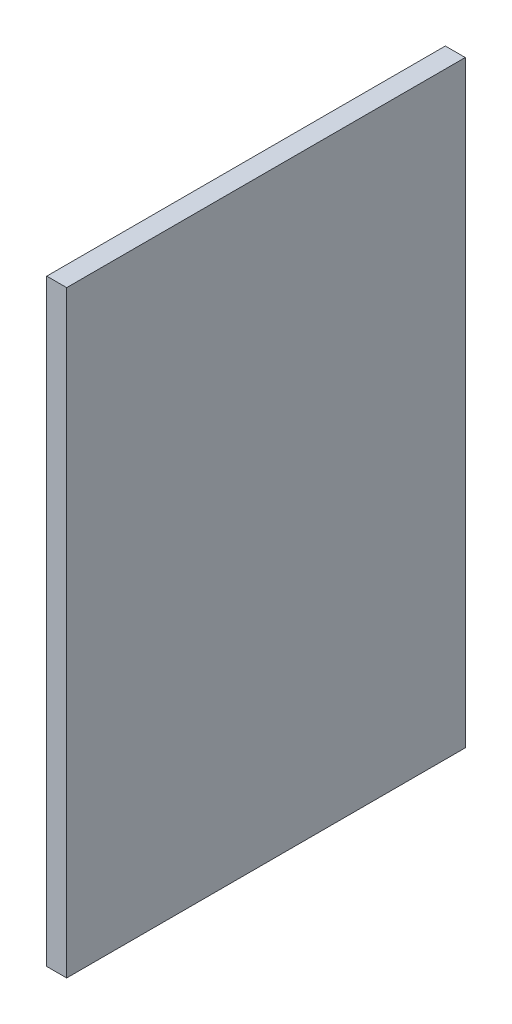
ISO-10303-21;
HEADER;
FILE_DESCRIPTION(('STEP AP214'),'2;1');
FILE_NAME('part.step','',(''),(''),'','','');
FILE_SCHEMA(('AUTOMOTIVE_DESIGN { 1 0 10303 214 1 1 1 1 }'));
ENDSEC;
DATA;
#1=APPLICATION_CONTEXT('core data for automotive mechanical design processes');
#2=APPLICATION_PROTOCOL_DEFINITION('international standard','automotive_design',2000,#1);
#3=PRODUCT_CONTEXT('',#1,'mechanical');
#4=PRODUCT('Part','Part','',(#3));
#5=PRODUCT_RELATED_PRODUCT_CATEGORY('part','',(#4));
#6=PRODUCT_DEFINITION_FORMATION('','',#4);
#7=PRODUCT_DEFINITION_CONTEXT('part definition',#1,'design');
#8=PRODUCT_DEFINITION('design','',#6,#7);
#9=PRODUCT_DEFINITION_SHAPE('','',#8);
#10=(LENGTH_UNIT() NAMED_UNIT(*) SI_UNIT(.MILLI.,.METRE.));
#11=(NAMED_UNIT(*) PLANE_ANGLE_UNIT() SI_UNIT($,.RADIAN.));
#12=(NAMED_UNIT(*) SI_UNIT($,.STERADIAN.) SOLID_ANGLE_UNIT());
#13=UNCERTAINTY_MEASURE_WITH_UNIT(LENGTH_MEASURE(1.E-05),#10,'distance_accuracy_value','');
#14=(GEOMETRIC_REPRESENTATION_CONTEXT(3) GLOBAL_UNCERTAINTY_ASSIGNED_CONTEXT((#13)) GLOBAL_UNIT_ASSIGNED_CONTEXT((#10,
#11,#12)) REPRESENTATION_CONTEXT('',''));
#15=CARTESIAN_POINT('',(0.,0.,0.));
#16=DIRECTION('',(0.,0.,1.));
#17=DIRECTION('',(1.,0.,0.));
#18=AXIS2_PLACEMENT_3D('',#15,#16,#17);
#19=CARTESIAN_POINT('',(0.,0.,200.));
#20=DIRECTION('',(1.,0.,0.));
#21=DIRECTION('',(0.,0.,-1.));
#22=AXIS2_PLACEMENT_3D('',#19,#20,#21);
#23=PLANE('',#22);
#24=DIRECTION('',(0.,-1.,0.));
#25=VECTOR('',#24,1.);
#26=CARTESIAN_POINT('',(0.,0.,0.));
#27=LINE('',#26,#25);
#28=CARTESIAN_POINT('',(0.,300.,0.));
#29=VERTEX_POINT('',#28);
#30=CARTESIAN_POINT('',(0.,0.,0.));
#31=VERTEX_POINT('',#30);
#32=EDGE_CURVE('E96',#29,#31,#27,.T.);
#33=ORIENTED_EDGE('',*,*,#32,.T.);
#34=DIRECTION('',(0.,0.,-1.));
#35=VECTOR('',#34,1.);
#36=CARTESIAN_POINT('',(0.,0.,200.));
#37=LINE('',#36,#35);
#38=CARTESIAN_POINT('',(0.,0.,200.));
#39=VERTEX_POINT('',#38);
#40=EDGE_CURVE('E11',#39,#31,#37,.T.);
#41=ORIENTED_EDGE('',*,*,#40,.F.);
#42=DIRECTION('',(0.,-1.,0.));
#43=VECTOR('',#42,1.);
#44=CARTESIAN_POINT('',(0.,0.,200.));
#45=LINE('',#44,#43);
#46=CARTESIAN_POINT('',(0.,300.,200.));
#47=VERTEX_POINT('',#46);
#48=EDGE_CURVE('E84',#47,#39,#45,.T.);
#49=ORIENTED_EDGE('',*,*,#48,.F.);
#50=DIRECTION('',(0.,0.,-1.));
#51=VECTOR('',#50,1.);
#52=CARTESIAN_POINT('',(0.,300.,200.));
#53=LINE('',#52,#51);
#54=EDGE_CURVE('E92',#47,#29,#53,.T.);
#55=ORIENTED_EDGE('',*,*,#54,.T.);
#56=EDGE_LOOP('',(#33,#41,#49,#55));
#57=FACE_BOUND('',#56,.T.);
#58=ADVANCED_FACE('F33',(#57),#23,.F.);
#59=CARTESIAN_POINT('',(0.,0.,200.));
#60=DIRECTION('',(0.,1.,0.));
#61=DIRECTION('',(0.,0.,1.));
#62=AXIS2_PLACEMENT_3D('',#59,#60,#61);
#63=PLANE('',#62);
#64=DIRECTION('',(1.,0.,0.));
#65=VECTOR('',#64,1.);
#66=CARTESIAN_POINT('',(0.,0.,0.));
#67=LINE('',#66,#65);
#68=CARTESIAN_POINT('',(10.,0.,0.));
#69=VERTEX_POINT('',#68);
#70=EDGE_CURVE('E88',#31,#69,#67,.T.);
#71=ORIENTED_EDGE('',*,*,#70,.T.);
#72=DIRECTION('',(0.,0.,-1.));
#73=VECTOR('',#72,1.);
#74=CARTESIAN_POINT('',(10.,0.,200.));
#75=LINE('',#74,#73);
#76=CARTESIAN_POINT('',(10.,0.,200.));
#77=VERTEX_POINT('',#76);
#78=EDGE_CURVE('E41',#77,#69,#75,.T.);
#79=ORIENTED_EDGE('',*,*,#78,.F.);
#80=DIRECTION('',(1.,0.,0.));
#81=VECTOR('',#80,1.);
#82=CARTESIAN_POINT('',(0.,0.,200.));
#83=LINE('',#82,#81);
#84=EDGE_CURVE('E79',#39,#77,#83,.T.);
#85=ORIENTED_EDGE('',*,*,#84,.F.);
#86=ORIENTED_EDGE('',*,*,#40,.T.);
#87=EDGE_LOOP('',(#71,#79,#85,#86));
#88=FACE_BOUND('',#87,.T.);
#89=ADVANCED_FACE('F87',(#88),#63,.F.);
#90=CARTESIAN_POINT('',(10.,0.,200.));
#91=DIRECTION('',(-1.,0.,0.));
#92=DIRECTION('',(0.,0.,1.));
#93=AXIS2_PLACEMENT_3D('',#90,#91,#92);
#94=PLANE('',#93);
#95=DIRECTION('',(0.,1.,0.));
#96=VECTOR('',#95,1.);
#97=CARTESIAN_POINT('',(10.,0.,0.));
#98=LINE('',#97,#96);
#99=CARTESIAN_POINT('',(10.,300.,0.));
#100=VERTEX_POINT('',#99);
#101=EDGE_CURVE('E66',#69,#100,#98,.T.);
#102=ORIENTED_EDGE('',*,*,#101,.T.);
#103=DIRECTION('',(0.,0.,-1.));
#104=VECTOR('',#103,1.);
#105=CARTESIAN_POINT('',(10.,300.,200.));
#106=LINE('',#105,#104);
#107=CARTESIAN_POINT('',(10.,300.,200.));
#108=VERTEX_POINT('',#107);
#109=EDGE_CURVE('E89',#108,#100,#106,.T.);
#110=ORIENTED_EDGE('',*,*,#109,.F.);
#111=DIRECTION('',(0.,1.,0.));
#112=VECTOR('',#111,1.);
#113=CARTESIAN_POINT('',(10.,0.,200.));
#114=LINE('',#113,#112);
#115=EDGE_CURVE('E82',#77,#108,#114,.T.);
#116=ORIENTED_EDGE('',*,*,#115,.F.);
#117=ORIENTED_EDGE('',*,*,#78,.T.);
#118=EDGE_LOOP('',(#102,#110,#116,#117));
#119=FACE_BOUND('',#118,.T.);
#120=ADVANCED_FACE('F90',(#119),#94,.F.);
#121=CARTESIAN_POINT('',(0.,300.,200.));
#122=DIRECTION('',(0.,-1.,0.));
#123=DIRECTION('',(0.,0.,-1.));
#124=AXIS2_PLACEMENT_3D('',#121,#122,#123);
#125=PLANE('',#124);
#126=DIRECTION('',(-1.,0.,0.));
#127=VECTOR('',#126,1.);
#128=CARTESIAN_POINT('',(0.,300.,0.));
#129=LINE('',#128,#127);
#130=EDGE_CURVE('E72',#100,#29,#129,.T.);
#131=ORIENTED_EDGE('',*,*,#130,.T.);
#132=ORIENTED_EDGE('',*,*,#54,.F.);
#133=DIRECTION('',(-1.,0.,0.));
#134=VECTOR('',#133,1.);
#135=CARTESIAN_POINT('',(0.,300.,200.));
#136=LINE('',#135,#134);
#137=EDGE_CURVE('E49',#108,#47,#136,.T.);
#138=ORIENTED_EDGE('',*,*,#137,.F.);
#139=ORIENTED_EDGE('',*,*,#109,.T.);
#140=EDGE_LOOP('',(#131,#132,#138,#139));
#141=FACE_BOUND('',#140,.T.);
#142=ADVANCED_FACE('F103',(#141),#125,.F.);
#143=CARTESIAN_POINT('',(0.,0.,200.));
#144=DIRECTION('',(0.,0.,-1.));
#145=DIRECTION('',(-1.,0.,0.));
#146=AXIS2_PLACEMENT_3D('',#143,#144,#145);
#147=PLANE('',#146);
#148=ORIENTED_EDGE('',*,*,#48,.T.);
#149=ORIENTED_EDGE('',*,*,#84,.T.);
#150=ORIENTED_EDGE('',*,*,#115,.T.);
#151=ORIENTED_EDGE('',*,*,#137,.T.);
#152=EDGE_LOOP('',(#148,#149,#150,#151));
#153=FACE_BOUND('',#152,.T.);
#154=ADVANCED_FACE('F80',(#153),#147,.F.);
#155=CARTESIAN_POINT('',(0.,0.,0.));
#156=DIRECTION('',(0.,0.,-1.));
#157=DIRECTION('',(-1.,0.,0.));
#158=AXIS2_PLACEMENT_3D('',#155,#156,#157);
#159=PLANE('',#158);
#160=ORIENTED_EDGE('',*,*,#32,.F.);
#161=ORIENTED_EDGE('',*,*,#130,.F.);
#162=ORIENTED_EDGE('',*,*,#101,.F.);
#163=ORIENTED_EDGE('',*,*,#70,.F.);
#164=EDGE_LOOP('',(#160,#161,#162,#163));
#165=FACE_BOUND('',#164,.T.);
#166=ADVANCED_FACE('F106',(#165),#159,.T.);
#167=CLOSED_SHELL('',(#58,#89,#120,#142,#154,#166));
#168=MANIFOLD_SOLID_BREP('B2',#167);
#169=ADVANCED_BREP_SHAPE_REPRESENTATION('',(#18,#168),#14);
#170=SHAPE_DEFINITION_REPRESENTATION(#9,#169);
ENDSEC;
END-ISO-10303-21;
